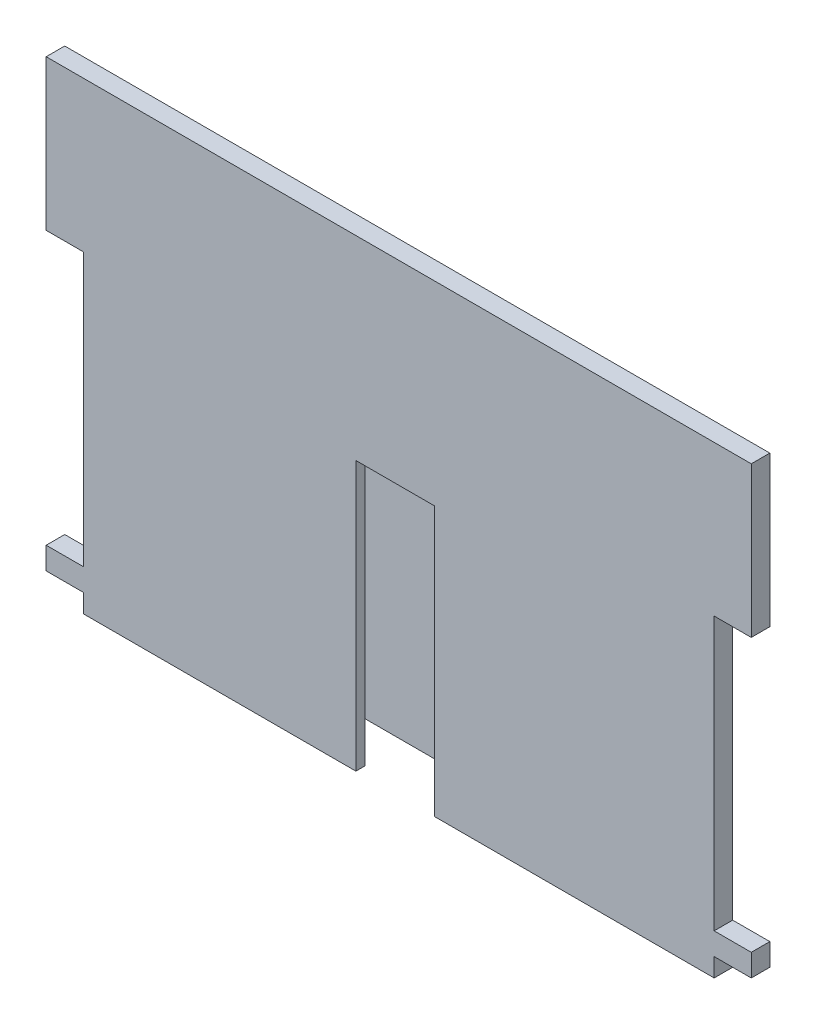
ISO-10303-21;
HEADER;
FILE_DESCRIPTION(('STEP AP214'),'2;1');
FILE_NAME('part.step','',(''),(''),'','','');
FILE_SCHEMA(('AUTOMOTIVE_DESIGN { 1 0 10303 214 1 1 1 1 }'));
ENDSEC;
DATA;
#1=APPLICATION_CONTEXT('core data for automotive mechanical design processes');
#2=APPLICATION_PROTOCOL_DEFINITION('international standard','automotive_design',2000,#1);
#3=PRODUCT_CONTEXT('',#1,'mechanical');
#4=PRODUCT('Part','Part','',(#3));
#5=PRODUCT_RELATED_PRODUCT_CATEGORY('part','',(#4));
#6=PRODUCT_DEFINITION_FORMATION('','',#4);
#7=PRODUCT_DEFINITION_CONTEXT('part definition',#1,'design');
#8=PRODUCT_DEFINITION('design','',#6,#7);
#9=PRODUCT_DEFINITION_SHAPE('','',#8);
#10=(LENGTH_UNIT() NAMED_UNIT(*) SI_UNIT(.MILLI.,.METRE.));
#11=(NAMED_UNIT(*) PLANE_ANGLE_UNIT() SI_UNIT($,.RADIAN.));
#12=(NAMED_UNIT(*) SI_UNIT($,.STERADIAN.) SOLID_ANGLE_UNIT());
#13=UNCERTAINTY_MEASURE_WITH_UNIT(LENGTH_MEASURE(1.E-05),#10,'distance_accuracy_value','');
#14=(GEOMETRIC_REPRESENTATION_CONTEXT(3) GLOBAL_UNCERTAINTY_ASSIGNED_CONTEXT((#13)) GLOBAL_UNIT_ASSIGNED_CONTEXT((#10,
#11,#12)) REPRESENTATION_CONTEXT('',''));
#15=CARTESIAN_POINT('',(0.,0.,0.));
#16=DIRECTION('',(0.,0.,1.));
#17=DIRECTION('',(1.,0.,0.));
#18=AXIS2_PLACEMENT_3D('',#15,#16,#17);
#19=CARTESIAN_POINT('',(-17.,0.5,1.));
#20=DIRECTION('',(0.,1.,0.));
#21=DIRECTION('',(0.,0.,1.));
#22=AXIS2_PLACEMENT_3D('',#19,#20,#21);
#23=PLANE('',#22);
#24=DIRECTION('',(0.,0.,1.));
#25=VECTOR('',#24,1.);
#26=CARTESIAN_POINT('',(1.92307692307692,0.5,1.));
#27=LINE('',#26,#25);
#28=CARTESIAN_POINT('',(1.92307692307692,0.5,0.5));
#29=VERTEX_POINT('',#28);
#30=CARTESIAN_POINT('',(1.92307692307692,0.5,1.));
#31=VERTEX_POINT('',#30);
#32=EDGE_CURVE('E360',#29,#31,#27,.T.);
#33=ORIENTED_EDGE('',*,*,#32,.F.);
#34=DIRECTION('',(1.,0.,0.));
#35=VECTOR('',#34,1.);
#36=CARTESIAN_POINT('',(-17.,0.5,0.5));
#37=LINE('',#36,#35);
#38=CARTESIAN_POINT('',(11.5384615384616,0.5,0.5));
#39=VERTEX_POINT('',#38);
#40=EDGE_CURVE('E235',#29,#39,#37,.T.);
#41=ORIENTED_EDGE('',*,*,#40,.T.);
#42=DIRECTION('',(0.,0.,1.));
#43=VECTOR('',#42,1.);
#44=CARTESIAN_POINT('',(11.5384615384616,0.5,1.));
#45=LINE('',#44,#43);
#46=CARTESIAN_POINT('',(11.5384615384616,0.5,0.));
#47=VERTEX_POINT('',#46);
#48=EDGE_CURVE('E280',#47,#39,#45,.T.);
#49=ORIENTED_EDGE('',*,*,#48,.F.);
#50=DIRECTION('',(1.,0.,0.));
#51=VECTOR('',#50,1.);
#52=CARTESIAN_POINT('',(-17.,0.5,0.));
#53=LINE('',#52,#51);
#54=CARTESIAN_POINT('',(17.,0.5,0.));
#55=VERTEX_POINT('',#54);
#56=EDGE_CURVE('E292',#47,#55,#53,.T.);
#57=ORIENTED_EDGE('',*,*,#56,.T.);
#58=DIRECTION('',(0.,0.,-1.));
#59=VECTOR('',#58,1.);
#60=CARTESIAN_POINT('',(17.,0.5,1.));
#61=LINE('',#60,#59);
#62=CARTESIAN_POINT('',(17.,0.5,1.));
#63=VERTEX_POINT('',#62);
#64=EDGE_CURVE('E236',#63,#55,#61,.T.);
#65=ORIENTED_EDGE('',*,*,#64,.F.);
#66=DIRECTION('',(1.,0.,0.));
#67=VECTOR('',#66,1.);
#68=CARTESIAN_POINT('',(-17.,0.5,1.));
#69=LINE('',#68,#67);
#70=EDGE_CURVE('E197',#31,#63,#69,.T.);
#71=ORIENTED_EDGE('',*,*,#70,.F.);
#72=EDGE_LOOP('',(#33,#41,#49,#57,#65,#71));
#73=FACE_BOUND('',#72,.T.);
#74=ADVANCED_FACE('F39',(#73),#23,.F.);
#75=DIRECTION('',(0.,0.,-1.));
#76=VECTOR('',#75,1.);
#77=CARTESIAN_POINT('',(-2.30769230769231,0.5,1.));
#78=LINE('',#77,#76);
#79=CARTESIAN_POINT('',(-2.30769230769231,0.5,1.));
#80=VERTEX_POINT('',#79);
#81=CARTESIAN_POINT('',(-2.30769230769231,0.5,0.5));
#82=VERTEX_POINT('',#81);
#83=EDGE_CURVE('E376',#80,#82,#78,.T.);
#84=ORIENTED_EDGE('',*,*,#83,.F.);
#85=CARTESIAN_POINT('',(-17.,0.5,1.));
#86=VERTEX_POINT('',#85);
#87=EDGE_CURVE('E204',#86,#80,#69,.T.);
#88=ORIENTED_EDGE('',*,*,#87,.F.);
#89=DIRECTION('',(0.,0.,-1.));
#90=VECTOR('',#89,1.);
#91=CARTESIAN_POINT('',(-17.,0.5,1.));
#92=LINE('',#91,#90);
#93=CARTESIAN_POINT('',(-17.,0.5,0.));
#94=VERTEX_POINT('',#93);
#95=EDGE_CURVE('E237',#86,#94,#92,.T.);
#96=ORIENTED_EDGE('',*,*,#95,.T.);
#97=DIRECTION('',(1.,0.,0.));
#98=VECTOR('',#97,1.);
#99=CARTESIAN_POINT('',(-17.,0.5,0.));
#100=LINE('',#99,#98);
#101=CARTESIAN_POINT('',(-11.5384615384615,0.5,0.));
#102=VERTEX_POINT('',#101);
#103=EDGE_CURVE('E289',#94,#102,#100,.T.);
#104=ORIENTED_EDGE('',*,*,#103,.T.);
#105=DIRECTION('',(0.,0.,-1.));
#106=VECTOR('',#105,1.);
#107=CARTESIAN_POINT('',(-11.5384615384615,0.5,1.));
#108=LINE('',#107,#106);
#109=CARTESIAN_POINT('',(-11.5384615384615,0.5,0.5));
#110=VERTEX_POINT('',#109);
#111=EDGE_CURVE('E231',#110,#102,#108,.T.);
#112=ORIENTED_EDGE('',*,*,#111,.F.);
#113=EDGE_CURVE('E227',#110,#82,#37,.T.);
#114=ORIENTED_EDGE('',*,*,#113,.T.);
#115=EDGE_LOOP('',(#84,#88,#96,#104,#112,#114));
#116=FACE_BOUND('',#115,.T.);
#117=ADVANCED_FACE('F475',(#116),#23,.F.);
#118=CARTESIAN_POINT('',(0.,0.,0.5));
#119=DIRECTION('',(0.,0.,1.));
#120=DIRECTION('',(1.,0.,0.));
#121=AXIS2_PLACEMENT_3D('',#118,#119,#120);
#122=PLANE('',#121);
#123=DIRECTION('',(0.,-1.,0.));
#124=VECTOR('',#123,1.);
#125=CARTESIAN_POINT('',(1.92307692307692,15.,0.5));
#126=LINE('',#125,#124);
#127=CARTESIAN_POINT('',(1.92307692307692,2.69230769230769,0.5));
#128=VERTEX_POINT('',#127);
#129=EDGE_CURVE('E11',#128,#29,#126,.T.);
#130=ORIENTED_EDGE('',*,*,#129,.F.);
#131=DIRECTION('',(-1.,0.,0.));
#132=VECTOR('',#131,1.);
#133=CARTESIAN_POINT('',(7.30769230769232,2.69230769230769,0.5));
#134=LINE('',#133,#132);
#135=CARTESIAN_POINT('',(7.30769230769232,2.69230769230769,0.5));
#136=VERTEX_POINT('',#135);
#137=EDGE_CURVE('E366',#136,#128,#134,.T.);
#138=ORIENTED_EDGE('',*,*,#137,.F.);
#139=DIRECTION('',(0.,-1.,0.));
#140=VECTOR('',#139,1.);
#141=CARTESIAN_POINT('',(7.30769230769232,15.,0.5));
#142=LINE('',#141,#140);
#143=CARTESIAN_POINT('',(7.30769230769232,15.,0.5));
#144=VERTEX_POINT('',#143);
#145=EDGE_CURVE('E372',#144,#136,#142,.T.);
#146=ORIENTED_EDGE('',*,*,#145,.F.);
#147=DIRECTION('',(-1.,0.,0.));
#148=VECTOR('',#147,1.);
#149=CARTESIAN_POINT('',(11.5384615384616,15.,0.5));
#150=LINE('',#149,#148);
#151=CARTESIAN_POINT('',(11.5384615384616,15.,0.5));
#152=VERTEX_POINT('',#151);
#153=EDGE_CURVE('E371',#152,#144,#150,.T.);
#154=ORIENTED_EDGE('',*,*,#153,.F.);
#155=DIRECTION('',(0.,1.,0.));
#156=VECTOR('',#155,1.);
#157=CARTESIAN_POINT('',(11.5384615384616,-15.,0.5));
#158=LINE('',#157,#156);
#159=EDGE_CURVE('E282',#39,#152,#158,.T.);
#160=ORIENTED_EDGE('',*,*,#159,.F.);
#161=ORIENTED_EDGE('',*,*,#40,.F.);
#162=EDGE_LOOP('',(#130,#138,#146,#154,#160,#161));
#163=FACE_BOUND('',#162,.T.);
#164=ADVANCED_FACE('F508',(#163),#122,.F.);
#165=DIRECTION('',(0.,1.,0.));
#166=VECTOR('',#165,1.);
#167=CARTESIAN_POINT('',(-2.30769230769231,-15.,0.5));
#168=LINE('',#167,#166);
#169=CARTESIAN_POINT('',(-2.30769230769231,2.69230769230769,0.5));
#170=VERTEX_POINT('',#169);
#171=EDGE_CURVE('E47',#82,#170,#168,.T.);
#172=ORIENTED_EDGE('',*,*,#171,.F.);
#173=ORIENTED_EDGE('',*,*,#113,.F.);
#174=DIRECTION('',(0.,-1.,0.));
#175=VECTOR('',#174,1.);
#176=CARTESIAN_POINT('',(-11.5384615384615,15.,0.5));
#177=LINE('',#176,#175);
#178=CARTESIAN_POINT('',(-11.5384615384615,15.,0.5));
#179=VERTEX_POINT('',#178);
#180=EDGE_CURVE('E344',#179,#110,#177,.T.);
#181=ORIENTED_EDGE('',*,*,#180,.F.);
#182=DIRECTION('',(-1.,0.,0.));
#183=VECTOR('',#182,1.);
#184=CARTESIAN_POINT('',(-7.30769230769229,15.,0.5));
#185=LINE('',#184,#183);
#186=CARTESIAN_POINT('',(-7.30769230769229,15.,0.5));
#187=VERTEX_POINT('',#186);
#188=EDGE_CURVE('E359',#187,#179,#185,.T.);
#189=ORIENTED_EDGE('',*,*,#188,.F.);
#190=DIRECTION('',(0.,1.,0.));
#191=VECTOR('',#190,1.);
#192=CARTESIAN_POINT('',(-7.30769230769229,2.69230769230769,0.5));
#193=LINE('',#192,#191);
#194=CARTESIAN_POINT('',(-7.30769230769229,2.69230769230769,0.5));
#195=VERTEX_POINT('',#194);
#196=EDGE_CURVE('E363',#195,#187,#193,.T.);
#197=ORIENTED_EDGE('',*,*,#196,.F.);
#198=EDGE_CURVE('E369',#170,#195,#134,.T.);
#199=ORIENTED_EDGE('',*,*,#198,.F.);
#200=EDGE_LOOP('',(#172,#173,#181,#189,#197,#199));
#201=FACE_BOUND('',#200,.T.);
#202=ADVANCED_FACE('F465',(#201),#122,.F.);
#203=CARTESIAN_POINT('',(0.,0.,0.));
#204=DIRECTION('',(0.,0.,-1.));
#205=DIRECTION('',(-1.,0.,0.));
#206=AXIS2_PLACEMENT_3D('',#203,#204,#205);
#207=PLANE('',#206);
#208=DIRECTION('',(-1.,0.,0.));
#209=VECTOR('',#208,1.);
#210=CARTESIAN_POINT('',(-7.30769230769229,15.,0.));
#211=LINE('',#210,#209);
#212=CARTESIAN_POINT('',(-7.30769230769229,15.,0.));
#213=VERTEX_POINT('',#212);
#214=CARTESIAN_POINT('',(-11.5384615384615,15.,0.));
#215=VERTEX_POINT('',#214);
#216=EDGE_CURVE('E285',#213,#215,#211,.T.);
#217=ORIENTED_EDGE('',*,*,#216,.T.);
#218=DIRECTION('',(0.,-1.,0.));
#219=VECTOR('',#218,1.);
#220=CARTESIAN_POINT('',(-11.5384615384615,15.,0.));
#221=LINE('',#220,#219);
#222=EDGE_CURVE('E277',#215,#102,#221,.T.);
#223=ORIENTED_EDGE('',*,*,#222,.T.);
#224=ORIENTED_EDGE('',*,*,#103,.F.);
#225=DIRECTION('',(0.,1.,0.));
#226=VECTOR('',#225,1.);
#227=CARTESIAN_POINT('',(-17.,1.5,0.));
#228=LINE('',#227,#226);
#229=CARTESIAN_POINT('',(-17.,1.5,0.));
#230=VERTEX_POINT('',#229);
#231=EDGE_CURVE('E295',#230,#94,#228,.F.);
#232=ORIENTED_EDGE('',*,*,#231,.F.);
#233=DIRECTION('',(-1.,0.,0.));
#234=VECTOR('',#233,1.);
#235=CARTESIAN_POINT('',(-19.,1.5,0.));
#236=LINE('',#235,#234);
#237=CARTESIAN_POINT('',(-19.,1.5,0.));
#238=VERTEX_POINT('',#237);
#239=EDGE_CURVE('E43',#238,#230,#236,.F.);
#240=ORIENTED_EDGE('',*,*,#239,.F.);
#241=DIRECTION('',(0.,1.,0.));
#242=VECTOR('',#241,1.);
#243=CARTESIAN_POINT('',(-19.,2.7,0.));
#244=LINE('',#243,#242);
#245=CARTESIAN_POINT('',(-19.,2.7,0.));
#246=VERTEX_POINT('',#245);
#247=EDGE_CURVE('E123',#246,#238,#244,.F.);
#248=ORIENTED_EDGE('',*,*,#247,.F.);
#249=DIRECTION('',(1.,0.,0.));
#250=VECTOR('',#249,1.);
#251=CARTESIAN_POINT('',(-17.,2.7,0.));
#252=LINE('',#251,#250);
#253=CARTESIAN_POINT('',(-17.,2.7,0.));
#254=VERTEX_POINT('',#253);
#255=EDGE_CURVE('E200',#254,#246,#252,.F.);
#256=ORIENTED_EDGE('',*,*,#255,.F.);
#257=DIRECTION('',(0.,1.,0.));
#258=VECTOR('',#257,1.);
#259=CARTESIAN_POINT('',(-17.,17.3947217067352,0.));
#260=LINE('',#259,#258);
#261=CARTESIAN_POINT('',(-17.,17.3947217067352,0.));
#262=VERTEX_POINT('',#261);
#263=EDGE_CURVE('E293',#262,#254,#260,.F.);
#264=ORIENTED_EDGE('',*,*,#263,.F.);
#265=DIRECTION('',(1.,0.,0.));
#266=VECTOR('',#265,1.);
#267=CARTESIAN_POINT('',(-19.,17.3947217067352,0.));
#268=LINE('',#267,#266);
#269=CARTESIAN_POINT('',(-19.,17.3947217067352,0.));
#270=VERTEX_POINT('',#269);
#271=EDGE_CURVE('E299',#270,#262,#268,.T.);
#272=ORIENTED_EDGE('',*,*,#271,.F.);
#273=DIRECTION('',(0.,1.,0.));
#274=VECTOR('',#273,1.);
#275=CARTESIAN_POINT('',(-19.,25.5,0.));
#276=LINE('',#275,#274);
#277=CARTESIAN_POINT('',(-19.,25.5,0.));
#278=VERTEX_POINT('',#277);
#279=EDGE_CURVE('E296',#278,#270,#276,.F.);
#280=ORIENTED_EDGE('',*,*,#279,.F.);
#281=DIRECTION('',(1.,0.,0.));
#282=VECTOR('',#281,1.);
#283=CARTESIAN_POINT('',(19.,25.5,0.));
#284=LINE('',#283,#282);
#285=CARTESIAN_POINT('',(19.,25.5,0.));
#286=VERTEX_POINT('',#285);
#287=EDGE_CURVE('E303',#286,#278,#284,.F.);
#288=ORIENTED_EDGE('',*,*,#287,.F.);
#289=DIRECTION('',(0.,1.,0.));
#290=VECTOR('',#289,1.);
#291=CARTESIAN_POINT('',(19.,17.3947217067352,0.));
#292=LINE('',#291,#290);
#293=CARTESIAN_POINT('',(19.,17.3947217067352,0.));
#294=VERTEX_POINT('',#293);
#295=EDGE_CURVE('E301',#294,#286,#292,.T.);
#296=ORIENTED_EDGE('',*,*,#295,.F.);
#297=DIRECTION('',(1.,0.,0.));
#298=VECTOR('',#297,1.);
#299=CARTESIAN_POINT('',(17.,17.3947217067352,0.));
#300=LINE('',#299,#298);
#301=CARTESIAN_POINT('',(17.,17.3947217067352,0.));
#302=VERTEX_POINT('',#301);
#303=EDGE_CURVE('E304',#302,#294,#300,.T.);
#304=ORIENTED_EDGE('',*,*,#303,.F.);
#305=DIRECTION('',(0.,1.,0.));
#306=VECTOR('',#305,1.);
#307=CARTESIAN_POINT('',(17.,2.7,0.));
#308=LINE('',#307,#306);
#309=CARTESIAN_POINT('',(17.,2.7,0.));
#310=VERTEX_POINT('',#309);
#311=EDGE_CURVE('E310',#310,#302,#308,.T.);
#312=ORIENTED_EDGE('',*,*,#311,.F.);
#313=DIRECTION('',(1.,0.,0.));
#314=VECTOR('',#313,1.);
#315=CARTESIAN_POINT('',(19.,2.7,0.));
#316=LINE('',#315,#314);
#317=CARTESIAN_POINT('',(19.,2.7,0.));
#318=VERTEX_POINT('',#317);
#319=EDGE_CURVE('E309',#318,#310,#316,.F.);
#320=ORIENTED_EDGE('',*,*,#319,.F.);
#321=DIRECTION('',(0.,1.,0.));
#322=VECTOR('',#321,1.);
#323=CARTESIAN_POINT('',(19.,1.5,0.));
#324=LINE('',#323,#322);
#325=CARTESIAN_POINT('',(19.,1.5,0.));
#326=VERTEX_POINT('',#325);
#327=EDGE_CURVE('E311',#326,#318,#324,.T.);
#328=ORIENTED_EDGE('',*,*,#327,.F.);
#329=DIRECTION('',(-1.,0.,0.));
#330=VECTOR('',#329,1.);
#331=CARTESIAN_POINT('',(17.,1.5,0.));
#332=LINE('',#331,#330);
#333=CARTESIAN_POINT('',(17.,1.5,0.));
#334=VERTEX_POINT('',#333);
#335=EDGE_CURVE('E313',#334,#326,#332,.F.);
#336=ORIENTED_EDGE('',*,*,#335,.F.);
#337=DIRECTION('',(0.,1.,0.));
#338=VECTOR('',#337,1.);
#339=CARTESIAN_POINT('',(17.,0.5,0.));
#340=LINE('',#339,#338);
#341=EDGE_CURVE('E288',#55,#334,#340,.T.);
#342=ORIENTED_EDGE('',*,*,#341,.F.);
#343=ORIENTED_EDGE('',*,*,#56,.F.);
#344=DIRECTION('',(0.,1.,0.));
#345=VECTOR('',#344,1.);
#346=CARTESIAN_POINT('',(11.5384615384616,-15.,0.));
#347=LINE('',#346,#345);
#348=CARTESIAN_POINT('',(11.5384615384616,15.,0.));
#349=VERTEX_POINT('',#348);
#350=EDGE_CURVE('E234',#47,#349,#347,.T.);
#351=ORIENTED_EDGE('',*,*,#350,.T.);
#352=DIRECTION('',(-1.,0.,0.));
#353=VECTOR('',#352,1.);
#354=CARTESIAN_POINT('',(11.5384615384616,15.,0.));
#355=LINE('',#354,#353);
#356=CARTESIAN_POINT('',(7.30769230769232,15.,0.));
#357=VERTEX_POINT('',#356);
#358=EDGE_CURVE('E354',#349,#357,#355,.T.);
#359=ORIENTED_EDGE('',*,*,#358,.T.);
#360=DIRECTION('',(0.,-1.,0.));
#361=VECTOR('',#360,1.);
#362=CARTESIAN_POINT('',(7.30769230769232,15.,0.));
#363=LINE('',#362,#361);
#364=CARTESIAN_POINT('',(7.30769230769232,2.69230769230769,0.));
#365=VERTEX_POINT('',#364);
#366=EDGE_CURVE('E353',#357,#365,#363,.T.);
#367=ORIENTED_EDGE('',*,*,#366,.T.);
#368=DIRECTION('',(-1.,0.,0.));
#369=VECTOR('',#368,1.);
#370=CARTESIAN_POINT('',(7.30769230769232,2.69230769230769,0.));
#371=LINE('',#370,#369);
#372=CARTESIAN_POINT('',(-7.30769230769229,2.69230769230769,0.));
#373=VERTEX_POINT('',#372);
#374=EDGE_CURVE('E346',#365,#373,#371,.T.);
#375=ORIENTED_EDGE('',*,*,#374,.T.);
#376=DIRECTION('',(0.,1.,0.));
#377=VECTOR('',#376,1.);
#378=CARTESIAN_POINT('',(-7.30769230769229,2.69230769230769,0.));
#379=LINE('',#378,#377);
#380=EDGE_CURVE('E343',#373,#213,#379,.T.);
#381=ORIENTED_EDGE('',*,*,#380,.T.);
#382=EDGE_LOOP('',(#217,#223,#224,#232,#240,#248,#256,#264,#272,#280,#288,#296,#304,#312,#320,
#328,#336,#342,#343,#351,#359,#367,#375,#381));
#383=FACE_BOUND('',#382,.T.);
#384=ADVANCED_FACE('F477',(#383),#207,.T.);
#385=CARTESIAN_POINT('',(-19.,1.5,1.));
#386=DIRECTION('',(0.,1.,0.));
#387=DIRECTION('',(-1.,0.,0.));
#388=AXIS2_PLACEMENT_3D('',#385,#386,#387);
#389=PLANE('',#388);
#390=ORIENTED_EDGE('',*,*,#239,.T.);
#391=DIRECTION('',(0.,0.,-1.));
#392=VECTOR('',#391,1.);
#393=CARTESIAN_POINT('',(-17.,1.5,1.));
#394=LINE('',#393,#392);
#395=CARTESIAN_POINT('',(-17.,1.5,1.));
#396=VERTEX_POINT('',#395);
#397=EDGE_CURVE('E191',#396,#230,#394,.T.);
#398=ORIENTED_EDGE('',*,*,#397,.F.);
#399=DIRECTION('',(1.,0.,0.));
#400=VECTOR('',#399,1.);
#401=CARTESIAN_POINT('',(-19.,1.5,1.));
#402=LINE('',#401,#400);
#403=CARTESIAN_POINT('',(-19.,1.5,1.));
#404=VERTEX_POINT('',#403);
#405=EDGE_CURVE('E181',#404,#396,#402,.T.);
#406=ORIENTED_EDGE('',*,*,#405,.F.);
#407=DIRECTION('',(0.,0.,-1.));
#408=VECTOR('',#407,1.);
#409=CARTESIAN_POINT('',(-19.,1.5,1.));
#410=LINE('',#409,#408);
#411=EDGE_CURVE('E186',#404,#238,#410,.T.);
#412=ORIENTED_EDGE('',*,*,#411,.T.);
#413=EDGE_LOOP('',(#390,#398,#406,#412));
#414=FACE_BOUND('',#413,.T.);
#415=ADVANCED_FACE('F41',(#414),#389,.F.);
#416=CARTESIAN_POINT('',(-17.,1.5,1.));
#417=DIRECTION('',(1.,0.,0.));
#418=DIRECTION('',(0.,0.,-1.));
#419=AXIS2_PLACEMENT_3D('',#416,#417,#418);
#420=PLANE('',#419);
#421=ORIENTED_EDGE('',*,*,#231,.T.);
#422=ORIENTED_EDGE('',*,*,#95,.F.);
#423=DIRECTION('',(0.,-1.,0.));
#424=VECTOR('',#423,1.);
#425=CARTESIAN_POINT('',(-17.,1.5,1.));
#426=LINE('',#425,#424);
#427=EDGE_CURVE('E127',#396,#86,#426,.T.);
#428=ORIENTED_EDGE('',*,*,#427,.F.);
#429=ORIENTED_EDGE('',*,*,#397,.T.);
#430=EDGE_LOOP('',(#421,#422,#428,#429));
#431=FACE_BOUND('',#430,.T.);
#432=ADVANCED_FACE('F492',(#431),#420,.F.);
#433=CARTESIAN_POINT('',(17.,0.5,1.));
#434=DIRECTION('',(-1.,0.,0.));
#435=DIRECTION('',(0.,0.,1.));
#436=AXIS2_PLACEMENT_3D('',#433,#434,#435);
#437=PLANE('',#436);
#438=ORIENTED_EDGE('',*,*,#341,.T.);
#439=DIRECTION('',(0.,0.,-1.));
#440=VECTOR('',#439,1.);
#441=CARTESIAN_POINT('',(17.,1.5,1.));
#442=LINE('',#441,#440);
#443=CARTESIAN_POINT('',(17.,1.5,1.));
#444=VERTEX_POINT('',#443);
#445=EDGE_CURVE('E244',#444,#334,#442,.T.);
#446=ORIENTED_EDGE('',*,*,#445,.F.);
#447=DIRECTION('',(0.,1.,0.));
#448=VECTOR('',#447,1.);
#449=CARTESIAN_POINT('',(17.,0.5,1.));
#450=LINE('',#449,#448);
#451=EDGE_CURVE('E207',#63,#444,#450,.T.);
#452=ORIENTED_EDGE('',*,*,#451,.F.);
#453=ORIENTED_EDGE('',*,*,#64,.T.);
#454=EDGE_LOOP('',(#438,#446,#452,#453));
#455=FACE_BOUND('',#454,.T.);
#456=ADVANCED_FACE('F496',(#455),#437,.F.);
#457=CARTESIAN_POINT('',(17.,1.5,1.));
#458=DIRECTION('',(0.,1.,0.));
#459=DIRECTION('',(-1.,0.,0.));
#460=AXIS2_PLACEMENT_3D('',#457,#458,#459);
#461=PLANE('',#460);
#462=ORIENTED_EDGE('',*,*,#335,.T.);
#463=DIRECTION('',(0.,0.,-1.));
#464=VECTOR('',#463,1.);
#465=CARTESIAN_POINT('',(19.,1.5,1.));
#466=LINE('',#465,#464);
#467=CARTESIAN_POINT('',(19.,1.5,1.));
#468=VERTEX_POINT('',#467);
#469=EDGE_CURVE('E243',#468,#326,#466,.T.);
#470=ORIENTED_EDGE('',*,*,#469,.F.);
#471=DIRECTION('',(1.,0.,0.));
#472=VECTOR('',#471,1.);
#473=CARTESIAN_POINT('',(17.,1.5,1.));
#474=LINE('',#473,#472);
#475=EDGE_CURVE('E210',#444,#468,#474,.T.);
#476=ORIENTED_EDGE('',*,*,#475,.F.);
#477=ORIENTED_EDGE('',*,*,#445,.T.);
#478=EDGE_LOOP('',(#462,#470,#476,#477));
#479=FACE_BOUND('',#478,.T.);
#480=ADVANCED_FACE('F501',(#479),#461,.F.);
#481=CARTESIAN_POINT('',(19.,1.5,1.));
#482=DIRECTION('',(-1.,0.,0.));
#483=DIRECTION('',(0.,0.,1.));
#484=AXIS2_PLACEMENT_3D('',#481,#482,#483);
#485=PLANE('',#484);
#486=ORIENTED_EDGE('',*,*,#327,.T.);
#487=DIRECTION('',(0.,0.,-1.));
#488=VECTOR('',#487,1.);
#489=CARTESIAN_POINT('',(19.,2.7,1.));
#490=LINE('',#489,#488);
#491=CARTESIAN_POINT('',(19.,2.7,1.));
#492=VERTEX_POINT('',#491);
#493=EDGE_CURVE('E246',#492,#318,#490,.T.);
#494=ORIENTED_EDGE('',*,*,#493,.F.);
#495=DIRECTION('',(0.,1.,0.));
#496=VECTOR('',#495,1.);
#497=CARTESIAN_POINT('',(19.,1.5,1.));
#498=LINE('',#497,#496);
#499=EDGE_CURVE('E208',#468,#492,#498,.T.);
#500=ORIENTED_EDGE('',*,*,#499,.F.);
#501=ORIENTED_EDGE('',*,*,#469,.T.);
#502=EDGE_LOOP('',(#486,#494,#500,#501));
#503=FACE_BOUND('',#502,.T.);
#504=ADVANCED_FACE('F511',(#503),#485,.F.);
#505=CARTESIAN_POINT('',(19.,2.7,1.));
#506=DIRECTION('',(0.,-1.,0.));
#507=DIRECTION('',(0.,0.,-1.));
#508=AXIS2_PLACEMENT_3D('',#505,#506,#507);
#509=PLANE('',#508);
#510=ORIENTED_EDGE('',*,*,#319,.T.);
#511=DIRECTION('',(0.,0.,-1.));
#512=VECTOR('',#511,1.);
#513=CARTESIAN_POINT('',(17.,2.7,1.));
#514=LINE('',#513,#512);
#515=CARTESIAN_POINT('',(17.,2.7,1.));
#516=VERTEX_POINT('',#515);
#517=EDGE_CURVE('E252',#516,#310,#514,.T.);
#518=ORIENTED_EDGE('',*,*,#517,.F.);
#519=DIRECTION('',(-1.,0.,0.));
#520=VECTOR('',#519,1.);
#521=CARTESIAN_POINT('',(19.,2.7,1.));
#522=LINE('',#521,#520);
#523=EDGE_CURVE('E212',#492,#516,#522,.T.);
#524=ORIENTED_EDGE('',*,*,#523,.F.);
#525=ORIENTED_EDGE('',*,*,#493,.T.);
#526=EDGE_LOOP('',(#510,#518,#524,#525));
#527=FACE_BOUND('',#526,.T.);
#528=ADVANCED_FACE('F516',(#527),#509,.F.);
#529=CARTESIAN_POINT('',(17.,2.7,1.));
#530=DIRECTION('',(-1.,0.,0.));
#531=DIRECTION('',(0.,0.,1.));
#532=AXIS2_PLACEMENT_3D('',#529,#530,#531);
#533=PLANE('',#532);
#534=ORIENTED_EDGE('',*,*,#311,.T.);
#535=DIRECTION('',(0.,0.,-1.));
#536=VECTOR('',#535,1.);
#537=CARTESIAN_POINT('',(17.,17.3947217067352,1.));
#538=LINE('',#537,#536);
#539=CARTESIAN_POINT('',(17.,17.3947217067352,1.));
#540=VERTEX_POINT('',#539);
#541=EDGE_CURVE('E251',#540,#302,#538,.T.);
#542=ORIENTED_EDGE('',*,*,#541,.F.);
#543=DIRECTION('',(0.,1.,0.));
#544=VECTOR('',#543,1.);
#545=CARTESIAN_POINT('',(17.,2.7,1.));
#546=LINE('',#545,#544);
#547=EDGE_CURVE('E215',#516,#540,#546,.T.);
#548=ORIENTED_EDGE('',*,*,#547,.F.);
#549=ORIENTED_EDGE('',*,*,#517,.T.);
#550=EDGE_LOOP('',(#534,#542,#548,#549));
#551=FACE_BOUND('',#550,.T.);
#552=ADVANCED_FACE('F524',(#551),#533,.F.);
#553=CARTESIAN_POINT('',(17.,17.3947217067352,1.));
#554=DIRECTION('',(0.,1.,0.));
#555=DIRECTION('',(0.,0.,1.));
#556=AXIS2_PLACEMENT_3D('',#553,#554,#555);
#557=PLANE('',#556);
#558=ORIENTED_EDGE('',*,*,#303,.T.);
#559=DIRECTION('',(0.,0.,-1.));
#560=VECTOR('',#559,1.);
#561=CARTESIAN_POINT('',(19.,17.3947217067352,1.));
#562=LINE('',#561,#560);
#563=CARTESIAN_POINT('',(19.,17.3947217067352,1.));
#564=VERTEX_POINT('',#563);
#565=EDGE_CURVE('E257',#564,#294,#562,.T.);
#566=ORIENTED_EDGE('',*,*,#565,.F.);
#567=DIRECTION('',(1.,0.,0.));
#568=VECTOR('',#567,1.);
#569=CARTESIAN_POINT('',(17.,17.3947217067352,1.));
#570=LINE('',#569,#568);
#571=EDGE_CURVE('E218',#540,#564,#570,.T.);
#572=ORIENTED_EDGE('',*,*,#571,.F.);
#573=ORIENTED_EDGE('',*,*,#541,.T.);
#574=EDGE_LOOP('',(#558,#566,#572,#573));
#575=FACE_BOUND('',#574,.T.);
#576=ADVANCED_FACE('F528',(#575),#557,.F.);
#577=CARTESIAN_POINT('',(19.,17.3947217067352,1.));
#578=DIRECTION('',(-1.,0.,0.));
#579=DIRECTION('',(0.,0.,1.));
#580=AXIS2_PLACEMENT_3D('',#577,#578,#579);
#581=PLANE('',#580);
#582=ORIENTED_EDGE('',*,*,#295,.T.);
#583=DIRECTION('',(0.,0.,-1.));
#584=VECTOR('',#583,1.);
#585=CARTESIAN_POINT('',(19.,25.5,1.));
#586=LINE('',#585,#584);
#587=CARTESIAN_POINT('',(19.,25.5,1.));
#588=VERTEX_POINT('',#587);
#589=EDGE_CURVE('E259',#588,#286,#586,.T.);
#590=ORIENTED_EDGE('',*,*,#589,.F.);
#591=DIRECTION('',(0.,1.,0.));
#592=VECTOR('',#591,1.);
#593=CARTESIAN_POINT('',(19.,17.3947217067352,1.));
#594=LINE('',#593,#592);
#595=EDGE_CURVE('E216',#564,#588,#594,.T.);
#596=ORIENTED_EDGE('',*,*,#595,.F.);
#597=ORIENTED_EDGE('',*,*,#565,.T.);
#598=EDGE_LOOP('',(#582,#590,#596,#597));
#599=FACE_BOUND('',#598,.T.);
#600=ADVANCED_FACE('F529',(#599),#581,.F.);
#601=CARTESIAN_POINT('',(19.,25.5,1.));
#602=DIRECTION('',(0.,-1.,0.));
#603=DIRECTION('',(0.,0.,-1.));
#604=AXIS2_PLACEMENT_3D('',#601,#602,#603);
#605=PLANE('',#604);
#606=ORIENTED_EDGE('',*,*,#287,.T.);
#607=DIRECTION('',(0.,0.,-1.));
#608=VECTOR('',#607,1.);
#609=CARTESIAN_POINT('',(-19.,25.5,1.));
#610=LINE('',#609,#608);
#611=CARTESIAN_POINT('',(-19.,25.5,1.));
#612=VERTEX_POINT('',#611);
#613=EDGE_CURVE('E261',#612,#278,#610,.T.);
#614=ORIENTED_EDGE('',*,*,#613,.F.);
#615=DIRECTION('',(-1.,0.,0.));
#616=VECTOR('',#615,1.);
#617=CARTESIAN_POINT('',(19.,25.5,1.));
#618=LINE('',#617,#616);
#619=EDGE_CURVE('E217',#588,#612,#618,.T.);
#620=ORIENTED_EDGE('',*,*,#619,.F.);
#621=ORIENTED_EDGE('',*,*,#589,.T.);
#622=EDGE_LOOP('',(#606,#614,#620,#621));
#623=FACE_BOUND('',#622,.T.);
#624=ADVANCED_FACE('F534',(#623),#605,.F.);
#625=CARTESIAN_POINT('',(-19.,25.5,1.));
#626=DIRECTION('',(1.,0.,0.));
#627=DIRECTION('',(0.,0.,-1.));
#628=AXIS2_PLACEMENT_3D('',#625,#626,#627);
#629=PLANE('',#628);
#630=ORIENTED_EDGE('',*,*,#279,.T.);
#631=DIRECTION('',(0.,0.,-1.));
#632=VECTOR('',#631,1.);
#633=CARTESIAN_POINT('',(-19.,17.3947217067352,1.));
#634=LINE('',#633,#632);
#635=CARTESIAN_POINT('',(-19.,17.3947217067352,1.));
#636=VERTEX_POINT('',#635);
#637=EDGE_CURVE('E266',#636,#270,#634,.T.);
#638=ORIENTED_EDGE('',*,*,#637,.F.);
#639=DIRECTION('',(0.,-1.,0.));
#640=VECTOR('',#639,1.);
#641=CARTESIAN_POINT('',(-19.,25.5,1.));
#642=LINE('',#641,#640);
#643=EDGE_CURVE('E225',#612,#636,#642,.T.);
#644=ORIENTED_EDGE('',*,*,#643,.F.);
#645=ORIENTED_EDGE('',*,*,#613,.T.);
#646=EDGE_LOOP('',(#630,#638,#644,#645));
#647=FACE_BOUND('',#646,.T.);
#648=ADVANCED_FACE('F538',(#647),#629,.F.);
#649=CARTESIAN_POINT('',(-19.,17.3947217067352,1.));
#650=DIRECTION('',(0.,1.,0.));
#651=DIRECTION('',(0.,0.,1.));
#652=AXIS2_PLACEMENT_3D('',#649,#650,#651);
#653=PLANE('',#652);
#654=ORIENTED_EDGE('',*,*,#271,.T.);
#655=DIRECTION('',(0.,0.,-1.));
#656=VECTOR('',#655,1.);
#657=CARTESIAN_POINT('',(-17.,17.3947217067352,1.));
#658=LINE('',#657,#656);
#659=CARTESIAN_POINT('',(-17.,17.3947217067352,1.));
#660=VERTEX_POINT('',#659);
#661=EDGE_CURVE('E267',#660,#262,#658,.T.);
#662=ORIENTED_EDGE('',*,*,#661,.F.);
#663=DIRECTION('',(1.,0.,0.));
#664=VECTOR('',#663,1.);
#665=CARTESIAN_POINT('',(-19.,17.3947217067352,1.));
#666=LINE('',#665,#664);
#667=EDGE_CURVE('E222',#636,#660,#666,.T.);
#668=ORIENTED_EDGE('',*,*,#667,.F.);
#669=ORIENTED_EDGE('',*,*,#637,.T.);
#670=EDGE_LOOP('',(#654,#662,#668,#669));
#671=FACE_BOUND('',#670,.T.);
#672=ADVANCED_FACE('F545',(#671),#653,.F.);
#673=CARTESIAN_POINT('',(-17.,17.3947217067352,1.));
#674=DIRECTION('',(1.,0.,0.));
#675=DIRECTION('',(0.,0.,-1.));
#676=AXIS2_PLACEMENT_3D('',#673,#674,#675);
#677=PLANE('',#676);
#678=ORIENTED_EDGE('',*,*,#263,.T.);
#679=DIRECTION('',(0.,0.,-1.));
#680=VECTOR('',#679,1.);
#681=CARTESIAN_POINT('',(-17.,2.7,1.));
#682=LINE('',#681,#680);
#683=CARTESIAN_POINT('',(-17.,2.7,1.));
#684=VERTEX_POINT('',#683);
#685=EDGE_CURVE('E275',#684,#254,#682,.T.);
#686=ORIENTED_EDGE('',*,*,#685,.F.);
#687=DIRECTION('',(0.,-1.,0.));
#688=VECTOR('',#687,1.);
#689=CARTESIAN_POINT('',(-17.,17.3947217067352,1.));
#690=LINE('',#689,#688);
#691=EDGE_CURVE('E226',#660,#684,#690,.T.);
#692=ORIENTED_EDGE('',*,*,#691,.F.);
#693=ORIENTED_EDGE('',*,*,#661,.T.);
#694=EDGE_LOOP('',(#678,#686,#692,#693));
#695=FACE_BOUND('',#694,.T.);
#696=ADVANCED_FACE('F546',(#695),#677,.F.);
#697=CARTESIAN_POINT('',(-17.,2.7,1.));
#698=DIRECTION('',(0.,-1.,0.));
#699=DIRECTION('',(0.,0.,-1.));
#700=AXIS2_PLACEMENT_3D('',#697,#698,#699);
#701=PLANE('',#700);
#702=ORIENTED_EDGE('',*,*,#255,.T.);
#703=DIRECTION('',(0.,0.,-1.));
#704=VECTOR('',#703,1.);
#705=CARTESIAN_POINT('',(-19.,2.7,1.));
#706=LINE('',#705,#704);
#707=CARTESIAN_POINT('',(-19.,2.7,1.));
#708=VERTEX_POINT('',#707);
#709=EDGE_CURVE('E195',#708,#246,#706,.T.);
#710=ORIENTED_EDGE('',*,*,#709,.F.);
#711=DIRECTION('',(-1.,0.,0.));
#712=VECTOR('',#711,1.);
#713=CARTESIAN_POINT('',(-17.,2.7,1.));
#714=LINE('',#713,#712);
#715=EDGE_CURVE('E182',#684,#708,#714,.T.);
#716=ORIENTED_EDGE('',*,*,#715,.F.);
#717=ORIENTED_EDGE('',*,*,#685,.T.);
#718=EDGE_LOOP('',(#702,#710,#716,#717));
#719=FACE_BOUND('',#718,.T.);
#720=ADVANCED_FACE('F549',(#719),#701,.F.);
#721=CARTESIAN_POINT('',(-19.,2.7,1.));
#722=DIRECTION('',(1.,0.,0.));
#723=DIRECTION('',(0.,0.,-1.));
#724=AXIS2_PLACEMENT_3D('',#721,#722,#723);
#725=PLANE('',#724);
#726=ORIENTED_EDGE('',*,*,#247,.T.);
#727=ORIENTED_EDGE('',*,*,#411,.F.);
#728=DIRECTION('',(0.,-1.,0.));
#729=VECTOR('',#728,1.);
#730=CARTESIAN_POINT('',(-19.,2.7,1.));
#731=LINE('',#730,#729);
#732=EDGE_CURVE('E180',#708,#404,#731,.T.);
#733=ORIENTED_EDGE('',*,*,#732,.F.);
#734=ORIENTED_EDGE('',*,*,#709,.T.);
#735=EDGE_LOOP('',(#726,#727,#733,#734));
#736=FACE_BOUND('',#735,.T.);
#737=ADVANCED_FACE('F187',(#736),#725,.F.);
#738=CARTESIAN_POINT('',(0.,0.,1.));
#739=DIRECTION('',(0.,0.,-1.));
#740=DIRECTION('',(-1.,0.,0.));
#741=AXIS2_PLACEMENT_3D('',#738,#739,#740);
#742=PLANE('',#741);
#743=ORIENTED_EDGE('',*,*,#87,.T.);
#744=DIRECTION('',(0.,1.,0.));
#745=VECTOR('',#744,1.);
#746=CARTESIAN_POINT('',(-2.30769230769231,-15.,1.));
#747=LINE('',#746,#745);
#748=CARTESIAN_POINT('',(-2.30769230769231,15.,1.));
#749=VERTEX_POINT('',#748);
#750=EDGE_CURVE('E389',#80,#749,#747,.T.);
#751=ORIENTED_EDGE('',*,*,#750,.T.);
#752=DIRECTION('',(1.,0.,0.));
#753=VECTOR('',#752,1.);
#754=CARTESIAN_POINT('',(-2.30769230769231,15.,1.));
#755=LINE('',#754,#753);
#756=CARTESIAN_POINT('',(1.92307692307692,15.,1.));
#757=VERTEX_POINT('',#756);
#758=EDGE_CURVE('E395',#749,#757,#755,.T.);
#759=ORIENTED_EDGE('',*,*,#758,.T.);
#760=DIRECTION('',(0.,-1.,0.));
#761=VECTOR('',#760,1.);
#762=CARTESIAN_POINT('',(1.92307692307692,15.,1.));
#763=LINE('',#762,#761);
#764=EDGE_CURVE('E393',#757,#31,#763,.T.);
#765=ORIENTED_EDGE('',*,*,#764,.T.);
#766=ORIENTED_EDGE('',*,*,#70,.T.);
#767=ORIENTED_EDGE('',*,*,#451,.T.);
#768=ORIENTED_EDGE('',*,*,#475,.T.);
#769=ORIENTED_EDGE('',*,*,#499,.T.);
#770=ORIENTED_EDGE('',*,*,#523,.T.);
#771=ORIENTED_EDGE('',*,*,#547,.T.);
#772=ORIENTED_EDGE('',*,*,#571,.T.);
#773=ORIENTED_EDGE('',*,*,#595,.T.);
#774=ORIENTED_EDGE('',*,*,#619,.T.);
#775=ORIENTED_EDGE('',*,*,#643,.T.);
#776=ORIENTED_EDGE('',*,*,#667,.T.);
#777=ORIENTED_EDGE('',*,*,#691,.T.);
#778=ORIENTED_EDGE('',*,*,#715,.T.);
#779=ORIENTED_EDGE('',*,*,#732,.T.);
#780=ORIENTED_EDGE('',*,*,#405,.T.);
#781=ORIENTED_EDGE('',*,*,#427,.T.);
#782=EDGE_LOOP('',(#743,#751,#759,#765,#766,#767,#768,#769,#770,#771,#772,#773,#774,#775,#776,
#777,#778,#779,#780,#781));
#783=FACE_BOUND('',#782,.T.);
#784=ADVANCED_FACE('F177',(#783),#742,.F.);
#785=CARTESIAN_POINT('',(11.5384615384616,-15.,0.5));
#786=DIRECTION('',(-1.,0.,0.));
#787=DIRECTION('',(0.,0.,1.));
#788=AXIS2_PLACEMENT_3D('',#785,#786,#787);
#789=PLANE('',#788);
#790=ORIENTED_EDGE('',*,*,#48,.T.);
#791=ORIENTED_EDGE('',*,*,#159,.T.);
#792=DIRECTION('',(0.,0.,-1.));
#793=VECTOR('',#792,1.);
#794=CARTESIAN_POINT('',(11.5384615384616,15.,0.5));
#795=LINE('',#794,#793);
#796=EDGE_CURVE('E202',#152,#349,#795,.T.);
#797=ORIENTED_EDGE('',*,*,#796,.T.);
#798=ORIENTED_EDGE('',*,*,#350,.F.);
#799=EDGE_LOOP('',(#790,#791,#797,#798));
#800=FACE_BOUND('',#799,.T.);
#801=ADVANCED_FACE('F562',(#800),#789,.T.);
#802=CARTESIAN_POINT('',(-11.5384615384615,15.,0.5));
#803=DIRECTION('',(1.,0.,0.));
#804=DIRECTION('',(0.,0.,-1.));
#805=AXIS2_PLACEMENT_3D('',#802,#803,#804);
#806=PLANE('',#805);
#807=ORIENTED_EDGE('',*,*,#111,.T.);
#808=ORIENTED_EDGE('',*,*,#222,.F.);
#809=DIRECTION('',(0.,0.,-1.));
#810=VECTOR('',#809,1.);
#811=CARTESIAN_POINT('',(-11.5384615384615,15.,0.5));
#812=LINE('',#811,#810);
#813=EDGE_CURVE('E339',#179,#215,#812,.T.);
#814=ORIENTED_EDGE('',*,*,#813,.F.);
#815=ORIENTED_EDGE('',*,*,#180,.T.);
#816=EDGE_LOOP('',(#807,#808,#814,#815));
#817=FACE_BOUND('',#816,.T.);
#818=ADVANCED_FACE('F472',(#817),#806,.T.);
#819=CARTESIAN_POINT('',(11.5384615384616,15.,0.5));
#820=DIRECTION('',(0.,-1.,0.));
#821=DIRECTION('',(0.,0.,-1.));
#822=AXIS2_PLACEMENT_3D('',#819,#820,#821);
#823=PLANE('',#822);
#824=ORIENTED_EDGE('',*,*,#358,.F.);
#825=ORIENTED_EDGE('',*,*,#796,.F.);
#826=ORIENTED_EDGE('',*,*,#153,.T.);
#827=DIRECTION('',(0.,0.,-1.));
#828=VECTOR('',#827,1.);
#829=CARTESIAN_POINT('',(7.30769230769232,15.,0.5));
#830=LINE('',#829,#828);
#831=EDGE_CURVE('E320',#144,#357,#830,.T.);
#832=ORIENTED_EDGE('',*,*,#831,.T.);
#833=EDGE_LOOP('',(#824,#825,#826,#832));
#834=FACE_BOUND('',#833,.T.);
#835=ADVANCED_FACE('F564',(#834),#823,.T.);
#836=CARTESIAN_POINT('',(7.30769230769232,15.,0.5));
#837=DIRECTION('',(1.,0.,0.));
#838=DIRECTION('',(0.,0.,-1.));
#839=AXIS2_PLACEMENT_3D('',#836,#837,#838);
#840=PLANE('',#839);
#841=ORIENTED_EDGE('',*,*,#366,.F.);
#842=ORIENTED_EDGE('',*,*,#831,.F.);
#843=ORIENTED_EDGE('',*,*,#145,.T.);
#844=DIRECTION('',(0.,0.,-1.));
#845=VECTOR('',#844,1.);
#846=CARTESIAN_POINT('',(7.30769230769232,2.69230769230769,0.5));
#847=LINE('',#846,#845);
#848=EDGE_CURVE('E323',#136,#365,#847,.T.);
#849=ORIENTED_EDGE('',*,*,#848,.T.);
#850=EDGE_LOOP('',(#841,#842,#843,#849));
#851=FACE_BOUND('',#850,.T.);
#852=ADVANCED_FACE('F569',(#851),#840,.T.);
#853=CARTESIAN_POINT('',(7.30769230769232,2.69230769230769,0.5));
#854=DIRECTION('',(0.,-1.,0.));
#855=DIRECTION('',(0.,0.,-1.));
#856=AXIS2_PLACEMENT_3D('',#853,#854,#855);
#857=PLANE('',#856);
#858=ORIENTED_EDGE('',*,*,#374,.F.);
#859=ORIENTED_EDGE('',*,*,#848,.F.);
#860=ORIENTED_EDGE('',*,*,#137,.T.);
#861=EDGE_CURVE('E368',#128,#170,#134,.T.);
#862=ORIENTED_EDGE('',*,*,#861,.T.);
#863=ORIENTED_EDGE('',*,*,#198,.T.);
#864=DIRECTION('',(0.,0.,-1.));
#865=VECTOR('',#864,1.);
#866=CARTESIAN_POINT('',(-7.30769230769229,2.69230769230769,0.5));
#867=LINE('',#866,#865);
#868=EDGE_CURVE('E332',#195,#373,#867,.T.);
#869=ORIENTED_EDGE('',*,*,#868,.T.);
#870=EDGE_LOOP('',(#858,#859,#860,#862,#863,#869));
#871=FACE_BOUND('',#870,.T.);
#872=ADVANCED_FACE('F489',(#871),#857,.T.);
#873=CARTESIAN_POINT('',(-7.30769230769229,2.69230769230769,0.5));
#874=DIRECTION('',(-1.,0.,0.));
#875=DIRECTION('',(0.,0.,1.));
#876=AXIS2_PLACEMENT_3D('',#873,#874,#875);
#877=PLANE('',#876);
#878=ORIENTED_EDGE('',*,*,#380,.F.);
#879=ORIENTED_EDGE('',*,*,#868,.F.);
#880=ORIENTED_EDGE('',*,*,#196,.T.);
#881=DIRECTION('',(0.,0.,-1.));
#882=VECTOR('',#881,1.);
#883=CARTESIAN_POINT('',(-7.30769230769229,15.,0.5));
#884=LINE('',#883,#882);
#885=EDGE_CURVE('E337',#187,#213,#884,.T.);
#886=ORIENTED_EDGE('',*,*,#885,.T.);
#887=EDGE_LOOP('',(#878,#879,#880,#886));
#888=FACE_BOUND('',#887,.T.);
#889=ADVANCED_FACE('F488',(#888),#877,.T.);
#890=CARTESIAN_POINT('',(-7.30769230769229,15.,0.5));
#891=DIRECTION('',(0.,-1.,0.));
#892=DIRECTION('',(0.,0.,-1.));
#893=AXIS2_PLACEMENT_3D('',#890,#891,#892);
#894=PLANE('',#893);
#895=ORIENTED_EDGE('',*,*,#216,.F.);
#896=ORIENTED_EDGE('',*,*,#885,.F.);
#897=ORIENTED_EDGE('',*,*,#188,.T.);
#898=ORIENTED_EDGE('',*,*,#813,.T.);
#899=EDGE_LOOP('',(#895,#896,#897,#898));
#900=FACE_BOUND('',#899,.T.);
#901=ADVANCED_FACE('F476',(#900),#894,.T.);
#902=CARTESIAN_POINT('',(0.,0.,0.5));
#903=DIRECTION('',(0.,0.,-1.));
#904=DIRECTION('',(-1.,0.,0.));
#905=AXIS2_PLACEMENT_3D('',#902,#903,#904);
#906=PLANE('',#905);
#907=CARTESIAN_POINT('',(1.92307692307692,15.,0.5));
#908=VERTEX_POINT('',#907);
#909=EDGE_CURVE('E51',#908,#128,#126,.T.);
#910=ORIENTED_EDGE('',*,*,#909,.F.);
#911=DIRECTION('',(1.,0.,0.));
#912=VECTOR('',#911,1.);
#913=CARTESIAN_POINT('',(-2.30769230769231,15.,0.5));
#914=LINE('',#913,#912);
#915=CARTESIAN_POINT('',(-2.30769230769231,15.,0.5));
#916=VERTEX_POINT('',#915);
#917=EDGE_CURVE('E388',#916,#908,#914,.T.);
#918=ORIENTED_EDGE('',*,*,#917,.F.);
#919=EDGE_CURVE('E387',#170,#916,#168,.T.);
#920=ORIENTED_EDGE('',*,*,#919,.F.);
#921=ORIENTED_EDGE('',*,*,#861,.F.);
#922=EDGE_LOOP('',(#910,#918,#920,#921));
#923=FACE_BOUND('',#922,.T.);
#924=ADVANCED_FACE('F495',(#923),#906,.F.);
#925=CARTESIAN_POINT('',(1.92307692307692,15.,0.5));
#926=DIRECTION('',(-1.,0.,0.));
#927=DIRECTION('',(0.,0.,1.));
#928=AXIS2_PLACEMENT_3D('',#925,#926,#927);
#929=PLANE('',#928);
#930=ORIENTED_EDGE('',*,*,#32,.T.);
#931=ORIENTED_EDGE('',*,*,#764,.F.);
#932=DIRECTION('',(0.,0.,1.));
#933=VECTOR('',#932,1.);
#934=CARTESIAN_POINT('',(1.92307692307692,15.,0.5));
#935=LINE('',#934,#933);
#936=EDGE_CURVE('E56',#908,#757,#935,.T.);
#937=ORIENTED_EDGE('',*,*,#936,.F.);
#938=ORIENTED_EDGE('',*,*,#909,.T.);
#939=ORIENTED_EDGE('',*,*,#129,.T.);
#940=EDGE_LOOP('',(#930,#931,#937,#938,#939));
#941=FACE_BOUND('',#940,.T.);
#942=ADVANCED_FACE('F411',(#941),#929,.T.);
#943=CARTESIAN_POINT('',(-2.30769230769231,-15.,0.5));
#944=DIRECTION('',(1.,0.,0.));
#945=DIRECTION('',(0.,0.,-1.));
#946=AXIS2_PLACEMENT_3D('',#943,#944,#945);
#947=PLANE('',#946);
#948=ORIENTED_EDGE('',*,*,#83,.T.);
#949=ORIENTED_EDGE('',*,*,#171,.T.);
#950=ORIENTED_EDGE('',*,*,#919,.T.);
#951=DIRECTION('',(0.,0.,1.));
#952=VECTOR('',#951,1.);
#953=CARTESIAN_POINT('',(-2.30769230769231,15.,0.5));
#954=LINE('',#953,#952);
#955=EDGE_CURVE('E381',#916,#749,#954,.T.);
#956=ORIENTED_EDGE('',*,*,#955,.T.);
#957=ORIENTED_EDGE('',*,*,#750,.F.);
#958=EDGE_LOOP('',(#948,#949,#950,#956,#957));
#959=FACE_BOUND('',#958,.T.);
#960=ADVANCED_FACE('F493',(#959),#947,.T.);
#961=CARTESIAN_POINT('',(-2.30769230769231,15.,0.5));
#962=DIRECTION('',(0.,-1.,0.));
#963=DIRECTION('',(0.,0.,-1.));
#964=AXIS2_PLACEMENT_3D('',#961,#962,#963);
#965=PLANE('',#964);
#966=ORIENTED_EDGE('',*,*,#758,.F.);
#967=ORIENTED_EDGE('',*,*,#955,.F.);
#968=ORIENTED_EDGE('',*,*,#917,.T.);
#969=ORIENTED_EDGE('',*,*,#936,.T.);
#970=EDGE_LOOP('',(#966,#967,#968,#969));
#971=FACE_BOUND('',#970,.T.);
#972=ADVANCED_FACE('F403',(#971),#965,.T.);
#973=CLOSED_SHELL('',(#74,#117,#164,#202,#384,#415,#432,#456,#480,#504,#528,#552,#576,#600,#624,
#648,#672,#696,#720,#737,#784,#801,#818,#835,#852,#872,#889,#901,#924,#942,#960,#972));
#974=MANIFOLD_SOLID_BREP('B2',#973);
#975=ADVANCED_BREP_SHAPE_REPRESENTATION('',(#18,#974),#14);
#976=SHAPE_DEFINITION_REPRESENTATION(#9,#975);
ENDSEC;
END-ISO-10303-21;
